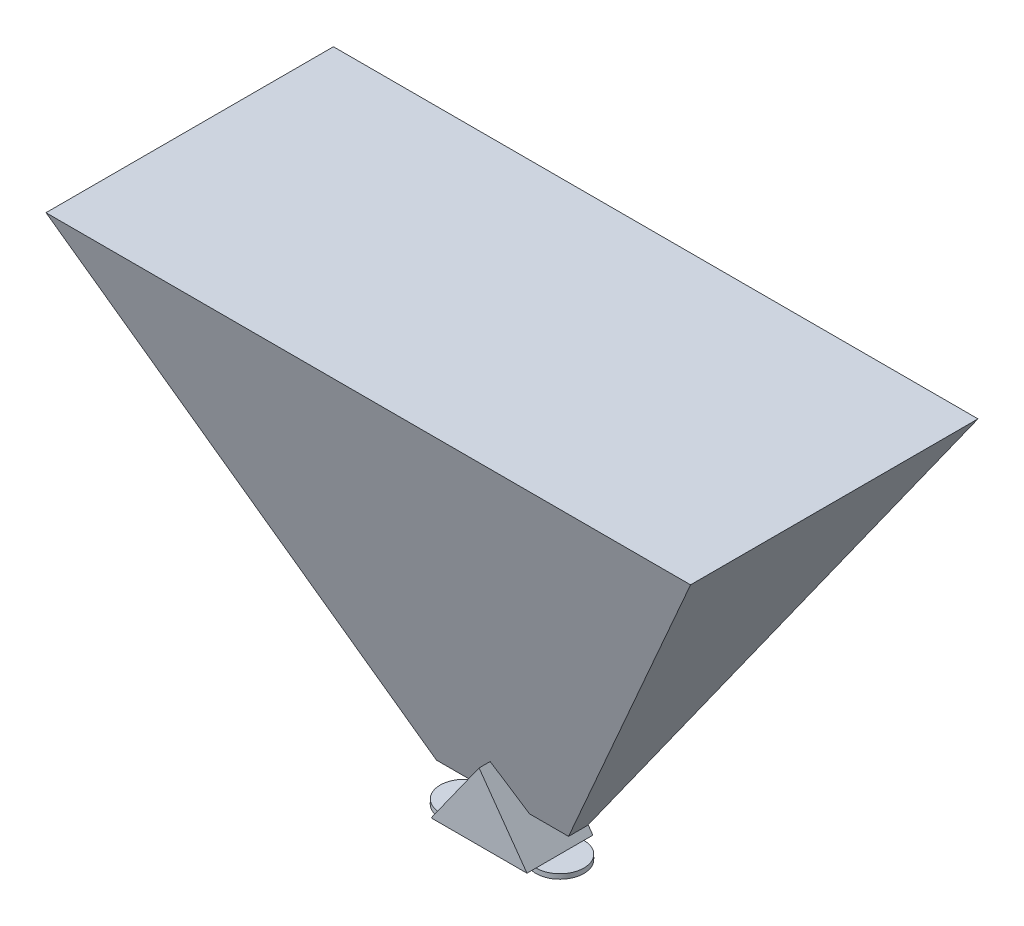
ISO-10303-21;
HEADER;
FILE_DESCRIPTION(('STEP AP214'),'2;1');
FILE_NAME('part.step','',(''),(''),'','','');
FILE_SCHEMA(('AUTOMOTIVE_DESIGN { 1 0 10303 214 1 1 1 1 }'));
ENDSEC;
DATA;
#1=APPLICATION_CONTEXT('core data for automotive mechanical design processes');
#2=APPLICATION_PROTOCOL_DEFINITION('international standard','automotive_design',2000,#1);
#3=PRODUCT_CONTEXT('',#1,'mechanical');
#4=PRODUCT('Part','Part','',(#3));
#5=PRODUCT_RELATED_PRODUCT_CATEGORY('part','',(#4));
#6=PRODUCT_DEFINITION_FORMATION('','',#4);
#7=PRODUCT_DEFINITION_CONTEXT('part definition',#1,'design');
#8=PRODUCT_DEFINITION('design','',#6,#7);
#9=PRODUCT_DEFINITION_SHAPE('','',#8);
#10=(LENGTH_UNIT() NAMED_UNIT(*) SI_UNIT(.MILLI.,.METRE.));
#11=(NAMED_UNIT(*) PLANE_ANGLE_UNIT() SI_UNIT($,.RADIAN.));
#12=(NAMED_UNIT(*) SI_UNIT($,.STERADIAN.) SOLID_ANGLE_UNIT());
#13=UNCERTAINTY_MEASURE_WITH_UNIT(LENGTH_MEASURE(1.E-05),#10,'distance_accuracy_value','');
#14=(GEOMETRIC_REPRESENTATION_CONTEXT(3) GLOBAL_UNCERTAINTY_ASSIGNED_CONTEXT((#13)) GLOBAL_UNIT_ASSIGNED_CONTEXT((#10,
#11,#12)) REPRESENTATION_CONTEXT('',''));
#15=CARTESIAN_POINT('',(0.,0.,0.));
#16=DIRECTION('',(0.,0.,1.));
#17=DIRECTION('',(1.,0.,0.));
#18=AXIS2_PLACEMENT_3D('',#15,#16,#17);
#19=CARTESIAN_POINT('',(0.,0.,-76.2));
#20=DIRECTION('',(0.,-1.,0.));
#21=DIRECTION('',(0.,0.,-1.));
#22=AXIS2_PLACEMENT_3D('',#19,#20,#21);
#23=PLANE('',#22);
#24=DIRECTION('',(1.,0.,0.));
#25=VECTOR('',#24,1.);
#26=CARTESIAN_POINT('',(-145.479084615994,0.,-17.4677334207872));
#27=LINE('',#26,#25);
#28=CARTESIAN_POINT('',(0.,0.,-17.4677334207872));
#29=VERTEX_POINT('',#28);
#30=CARTESIAN_POINT('',(50.8,0.,-17.4677334207872));
#31=VERTEX_POINT('',#30);
#32=EDGE_CURVE('E126',#29,#31,#27,.T.);
#33=ORIENTED_EDGE('',*,*,#32,.T.);
#34=DIRECTION('',(0.,0.,1.));
#35=VECTOR('',#34,1.);
#36=CARTESIAN_POINT('',(50.8,0.,-76.2));
#37=LINE('',#36,#35);
#38=CARTESIAN_POINT('',(50.8,0.,-12.7));
#39=VERTEX_POINT('',#38);
#40=EDGE_CURVE('E133',#31,#39,#37,.T.);
#41=ORIENTED_EDGE('',*,*,#40,.T.);
#42=CARTESIAN_POINT('',(50.8,0.,0.));
#43=DIRECTION('',(0.,-1.,0.));
#44=DIRECTION('',(0.,0.,-1.));
#45=AXIS2_PLACEMENT_3D('',#42,#43,#44);
#46=CIRCLE('',#45,12.7);
#47=CARTESIAN_POINT('',(50.8,0.,12.7));
#48=VERTEX_POINT('',#47);
#49=EDGE_CURVE('E184',#39,#48,#46,.F.);
#50=ORIENTED_EDGE('',*,*,#49,.T.);
#51=CARTESIAN_POINT('',(50.8,0.,17.4677334207872));
#52=VERTEX_POINT('',#51);
#53=EDGE_CURVE('E145',#48,#52,#37,.T.);
#54=ORIENTED_EDGE('',*,*,#53,.T.);
#55=DIRECTION('',(1.,0.,0.));
#56=VECTOR('',#55,1.);
#57=CARTESIAN_POINT('',(-145.479084615994,0.,17.4677334207872));
#58=LINE('',#57,#56);
#59=CARTESIAN_POINT('',(0.,0.,17.4677334207872));
#60=VERTEX_POINT('',#59);
#61=EDGE_CURVE('E61',#60,#52,#58,.T.);
#62=ORIENTED_EDGE('',*,*,#61,.F.);
#63=DIRECTION('',(0.,0.,1.));
#64=VECTOR('',#63,1.);
#65=CARTESIAN_POINT('',(0.,0.,-76.2));
#66=LINE('',#65,#64);
#67=CARTESIAN_POINT('',(0.,0.,12.7));
#68=VERTEX_POINT('',#67);
#69=EDGE_CURVE('E152',#68,#60,#66,.T.);
#70=ORIENTED_EDGE('',*,*,#69,.F.);
#71=CARTESIAN_POINT('',(0.,0.,0.));
#72=DIRECTION('',(0.,-1.,0.));
#73=DIRECTION('',(0.,0.,-1.));
#74=AXIS2_PLACEMENT_3D('',#71,#72,#73);
#75=CIRCLE('',#74,12.7);
#76=CARTESIAN_POINT('',(0.,0.,-12.7));
#77=VERTEX_POINT('',#76);
#78=EDGE_CURVE('E237',#77,#68,#75,.T.);
#79=ORIENTED_EDGE('',*,*,#78,.F.);
#80=EDGE_CURVE('E136',#29,#77,#66,.T.);
#81=ORIENTED_EDGE('',*,*,#80,.F.);
#82=EDGE_LOOP('',(#33,#41,#50,#54,#62,#70,#79,#81));
#83=FACE_BOUND('',#82,.T.);
#84=ADVANCED_FACE('F39',(#83),#23,.T.);
#85=CARTESIAN_POINT('',(-152.4,15.4986607616986,0.));
#86=DIRECTION('',(0.,1.,0.));
#87=DIRECTION('',(0.,0.,1.));
#88=AXIS2_PLACEMENT_3D('',#85,#86,#87);
#89=PLANE('',#88);
#90=DIRECTION('',(0.,0.,1.));
#91=VECTOR('',#90,1.);
#92=CARTESIAN_POINT('',(60.4133221390996,15.4986607616985,-76.2));
#93=LINE('',#92,#91);
#94=CARTESIAN_POINT('',(60.4133221390996,15.4986607616985,-5.03582014670799));
#95=VERTEX_POINT('',#94);
#96=CARTESIAN_POINT('',(60.4133221390996,15.4986607616985,5.03582014670785));
#97=VERTEX_POINT('',#96);
#98=EDGE_CURVE('E201',#95,#97,#93,.T.);
#99=ORIENTED_EDGE('',*,*,#98,.T.);
#100=DIRECTION('',(1.,0.,0.));
#101=VECTOR('',#100,1.);
#102=CARTESIAN_POINT('',(-152.4,15.4986607616986,5.03582014670786));
#103=LINE('',#102,#101);
#104=CARTESIAN_POINT('',(39.7540143591478,15.4986607616985,5.03582014670786));
#105=VERTEX_POINT('',#104);
#106=EDGE_CURVE('E196',#105,#97,#103,.T.);
#107=ORIENTED_EDGE('',*,*,#106,.F.);
#108=DIRECTION('',(0.,0.,1.));
#109=VECTOR('',#108,1.);
#110=CARTESIAN_POINT('',(39.7540143591478,15.4986607616986,-76.2));
#111=LINE('',#110,#109);
#112=CARTESIAN_POINT('',(39.7540143591478,15.4986607616986,-5.03582014670799));
#113=VERTEX_POINT('',#112);
#114=EDGE_CURVE('E171',#113,#105,#111,.T.);
#115=ORIENTED_EDGE('',*,*,#114,.F.);
#116=DIRECTION('',(1.,0.,0.));
#117=VECTOR('',#116,1.);
#118=CARTESIAN_POINT('',(-152.4,15.4986607616986,-5.03582014670799));
#119=LINE('',#118,#117);
#120=EDGE_CURVE('E214',#113,#95,#119,.T.);
#121=ORIENTED_EDGE('',*,*,#120,.T.);
#122=EDGE_LOOP('',(#99,#107,#115,#121));
#123=FACE_BOUND('',#122,.T.);
#124=ADVANCED_FACE('F199',(#123),#89,.F.);
#125=CARTESIAN_POINT('',(-152.4,0.,0.));
#126=DIRECTION('',(0.,0.309016994374942,-0.951056516295155));
#127=DIRECTION('',(0.,0.951056516295155,0.309016994374942));
#128=AXIS2_PLACEMENT_3D('',#125,#126,#127);
#129=PLANE('',#128);
#130=DIRECTION('',(-0.508091264626095,-0.819148056465713,-0.26615733767661));
#131=VECTOR('',#130,1.);
#132=CARTESIAN_POINT('',(-1.65744818407482,-84.5722406952965,-27.4791867564514));
#133=LINE('',#132,#131);
#134=CARTESIAN_POINT('',(196.264914484343,234.519485532759,76.2));
#135=VERTEX_POINT('',#134);
#136=EDGE_CURVE('E229',#135,#97,#133,.T.);
#137=ORIENTED_EDGE('',*,*,#136,.F.);
#138=DIRECTION('',(1.,0.,0.));
#139=VECTOR('',#138,1.);
#140=CARTESIAN_POINT('',(-152.4,234.519485532759,76.2));
#141=LINE('',#140,#139);
#142=CARTESIAN_POINT('',(-145.479084615994,234.519485532759,76.2));
#143=VERTEX_POINT('',#142);
#144=EDGE_CURVE('E203',#143,#135,#141,.T.);
#145=ORIENTED_EDGE('',*,*,#144,.F.);
#146=DIRECTION('',(0.508127980437823,-0.819127456511238,-0.266150644345659));
#147=VECTOR('',#146,1.);
#148=CARTESIAN_POINT('',(-39.3487723823864,63.4321688222073,20.6103610251056));
#149=LINE('',#148,#147);
#150=CARTESIAN_POINT('',(-9.61425859887299,15.498660761696,5.03582014670743));
#151=VERTEX_POINT('',#150);
#152=EDGE_CURVE('E208',#143,#151,#149,.T.);
#153=ORIENTED_EDGE('',*,*,#152,.T.);
#154=CARTESIAN_POINT('',(11.0459856408521,15.4986607616986,5.03582014670787));
#155=VERTEX_POINT('',#154);
#156=EDGE_CURVE('E202',#151,#155,#103,.T.);
#157=ORIENTED_EDGE('',*,*,#156,.T.);
#158=DIRECTION('',(-0.56107743663193,-0.787249697233074,-0.255792932484413));
#159=VECTOR('',#158,1.);
#160=CARTESIAN_POINT('',(12.8018805960927,17.9623630630852,5.83632555008273));
#161=LINE('',#160,#159);
#162=CARTESIAN_POINT('',(25.3999999999999,35.6388280907428,11.5797571973407));
#163=VERTEX_POINT('',#162);
#164=EDGE_CURVE('E160',#163,#155,#161,.T.);
#165=ORIENTED_EDGE('',*,*,#164,.F.);
#166=DIRECTION('',(-0.561077436631934,0.787249697233071,0.255792932484412));
#167=VECTOR('',#166,1.);
#168=CARTESIAN_POINT('',(37.9981194039071,17.9623630630854,5.83632555008276));
#169=LINE('',#168,#167);
#170=EDGE_CURVE('E173',#105,#163,#169,.T.);
#171=ORIENTED_EDGE('',*,*,#170,.F.);
#172=ORIENTED_EDGE('',*,*,#106,.T.);
#173=EDGE_LOOP('',(#137,#145,#153,#157,#165,#171,#172));
#174=FACE_BOUND('',#173,.T.);
#175=ADVANCED_FACE('F195',(#174),#129,.F.);
#176=CARTESIAN_POINT('',(-152.4,0.,0.));
#177=DIRECTION('',(0.,0.309016994374948,0.951056516295153));
#178=DIRECTION('',(0.,-0.951056516295154,0.309016994374948));
#179=AXIS2_PLACEMENT_3D('',#176,#177,#178);
#180=PLANE('',#179);
#181=DIRECTION('',(0.508091264626094,0.819148056465712,-0.266157337676615));
#182=VECTOR('',#181,1.);
#183=CARTESIAN_POINT('',(-1.65744818407465,-84.5722406952963,27.4791867564519));
#184=LINE('',#183,#182);
#185=CARTESIAN_POINT('',(196.264914484343,234.519485532759,-76.2));
#186=VERTEX_POINT('',#185);
#187=EDGE_CURVE('E181',#95,#186,#184,.T.);
#188=ORIENTED_EDGE('',*,*,#187,.F.);
#189=ORIENTED_EDGE('',*,*,#120,.F.);
#190=DIRECTION('',(0.561077436631934,-0.78724969723307,0.255792932484417));
#191=VECTOR('',#190,1.);
#192=CARTESIAN_POINT('',(16.1257258309884,48.651594341759,-15.807861254771));
#193=LINE('',#192,#191);
#194=CARTESIAN_POINT('',(25.3999999999999,35.6388280907428,-11.579757197341));
#195=VERTEX_POINT('',#194);
#196=EDGE_CURVE('E168',#195,#113,#193,.T.);
#197=ORIENTED_EDGE('',*,*,#196,.F.);
#198=DIRECTION('',(0.561077436631929,0.787249697233073,-0.255792932484418));
#199=VECTOR('',#198,1.);
#200=CARTESIAN_POINT('',(34.6742741690113,48.6515943417591,-15.807861254771));
#201=LINE('',#200,#199);
#202=CARTESIAN_POINT('',(11.0459856408521,15.4986607616986,-5.03582014670799));
#203=VERTEX_POINT('',#202);
#204=EDGE_CURVE('E165',#203,#195,#201,.T.);
#205=ORIENTED_EDGE('',*,*,#204,.F.);
#206=CARTESIAN_POINT('',(-9.61425859887299,15.498660761696,-5.03582014670756));
#207=VERTEX_POINT('',#206);
#208=EDGE_CURVE('E213',#207,#203,#119,.T.);
#209=ORIENTED_EDGE('',*,*,#208,.F.);
#210=DIRECTION('',(-0.508127980437822,0.819127456511237,-0.266150644345665));
#211=VECTOR('',#210,1.);
#212=CARTESIAN_POINT('',(-39.3487723823863,63.4321688222071,-20.610361025106));
#213=LINE('',#212,#211);
#214=CARTESIAN_POINT('',(-145.479084615994,234.519485532759,-76.2));
#215=VERTEX_POINT('',#214);
#216=EDGE_CURVE('E178',#207,#215,#213,.T.);
#217=ORIENTED_EDGE('',*,*,#216,.T.);
#218=DIRECTION('',(1.,0.,0.));
#219=VECTOR('',#218,1.);
#220=CARTESIAN_POINT('',(-152.4,234.519485532754,-76.2));
#221=LINE('',#220,#219);
#222=EDGE_CURVE('E205',#215,#186,#221,.T.);
#223=ORIENTED_EDGE('',*,*,#222,.T.);
#224=EDGE_LOOP('',(#188,#189,#197,#205,#209,#217,#223));
#225=FACE_BOUND('',#224,.T.);
#226=ADVANCED_FACE('F219',(#225),#180,.F.);
#227=CARTESIAN_POINT('',(25.3999999999999,35.6388280907428,-76.2));
#228=DIRECTION('',(-0.814341541912721,0.580385951858944,0.));
#229=DIRECTION('',(-0.580385951858944,-0.814341541912721,0.));
#230=AXIS2_PLACEMENT_3D('',#227,#228,#229);
#231=PLANE('',#230);
#232=DIRECTION('',(0.580385951858944,0.814341541912721,0.));
#233=VECTOR('',#232,1.);
#234=CARTESIAN_POINT('',(25.3999999999999,35.6388280907428,-17.4677334207873));
#235=LINE('',#234,#233);
#236=CARTESIAN_POINT('',(25.3999999999999,35.6388280907428,-17.4677334207873));
#237=VERTEX_POINT('',#236);
#238=EDGE_CURVE('E53',#29,#237,#235,.T.);
#239=ORIENTED_EDGE('',*,*,#238,.F.);
#240=ORIENTED_EDGE('',*,*,#80,.T.);
#241=EDGE_CURVE('E151',#77,#68,#66,.T.);
#242=ORIENTED_EDGE('',*,*,#241,.T.);
#243=ORIENTED_EDGE('',*,*,#69,.T.);
#244=DIRECTION('',(-0.580385951858944,-0.814341541912721,0.));
#245=VECTOR('',#244,1.);
#246=CARTESIAN_POINT('',(25.3999999999999,35.6388280907428,17.4677334207872));
#247=LINE('',#246,#245);
#248=CARTESIAN_POINT('',(25.3999999999999,35.6388280907427,17.4677334207872));
#249=VERTEX_POINT('',#248);
#250=EDGE_CURVE('E186',#249,#60,#247,.T.);
#251=ORIENTED_EDGE('',*,*,#250,.F.);
#252=DIRECTION('',(0.,0.,1.));
#253=VECTOR('',#252,1.);
#254=CARTESIAN_POINT('',(25.3999999999999,35.6388280907428,-76.2));
#255=LINE('',#254,#253);
#256=EDGE_CURVE('E143',#163,#249,#255,.T.);
#257=ORIENTED_EDGE('',*,*,#256,.F.);
#258=ORIENTED_EDGE('',*,*,#164,.T.);
#259=DIRECTION('',(0.,0.,-1.));
#260=VECTOR('',#259,1.);
#261=CARTESIAN_POINT('',(11.0459856408521,15.4986607616986,-76.2));
#262=LINE('',#261,#260);
#263=EDGE_CURVE('E156',#155,#203,#262,.T.);
#264=ORIENTED_EDGE('',*,*,#263,.T.);
#265=ORIENTED_EDGE('',*,*,#204,.T.);
#266=EDGE_CURVE('E147',#237,#195,#255,.T.);
#267=ORIENTED_EDGE('',*,*,#266,.F.);
#268=EDGE_LOOP('',(#239,#240,#242,#243,#251,#257,#258,#264,#265,#267));
#269=FACE_BOUND('',#268,.T.);
#270=ADVANCED_FACE('F41',(#269),#231,.T.);
#271=CARTESIAN_POINT('',(25.3999999999999,35.6388280907428,-76.2));
#272=DIRECTION('',(0.814341541912718,0.580385951858948,0.));
#273=DIRECTION('',(-0.580385951858948,0.814341541912718,0.));
#274=AXIS2_PLACEMENT_3D('',#271,#272,#273);
#275=PLANE('',#274);
#276=DIRECTION('',(0.580385951858948,-0.814341541912718,0.));
#277=VECTOR('',#276,1.);
#278=CARTESIAN_POINT('',(25.3999999999998,35.6388280907428,-17.4677334207873));
#279=LINE('',#278,#277);
#280=EDGE_CURVE('E11',#237,#31,#279,.T.);
#281=ORIENTED_EDGE('',*,*,#280,.F.);
#282=ORIENTED_EDGE('',*,*,#266,.T.);
#283=ORIENTED_EDGE('',*,*,#196,.T.);
#284=ORIENTED_EDGE('',*,*,#114,.T.);
#285=ORIENTED_EDGE('',*,*,#170,.T.);
#286=ORIENTED_EDGE('',*,*,#256,.T.);
#287=DIRECTION('',(-0.580385951858948,0.814341541912718,0.));
#288=VECTOR('',#287,1.);
#289=CARTESIAN_POINT('',(25.3999999999999,35.6388280907428,17.4677334207872));
#290=LINE('',#289,#288);
#291=EDGE_CURVE('E47',#52,#249,#290,.T.);
#292=ORIENTED_EDGE('',*,*,#291,.F.);
#293=ORIENTED_EDGE('',*,*,#53,.F.);
#294=EDGE_CURVE('E142',#39,#48,#37,.T.);
#295=ORIENTED_EDGE('',*,*,#294,.F.);
#296=ORIENTED_EDGE('',*,*,#40,.F.);
#297=EDGE_LOOP('',(#281,#282,#283,#284,#285,#286,#292,#293,#295,#296));
#298=FACE_BOUND('',#297,.T.);
#299=ADVANCED_FACE('F139',(#298),#275,.T.);
#300=ORIENTED_EDGE('',*,*,#156,.F.);
#301=DIRECTION('',(0.,0.,1.));
#302=VECTOR('',#301,1.);
#303=CARTESIAN_POINT('',(-9.61425859887299,15.498660761696,-76.2));
#304=LINE('',#303,#302);
#305=EDGE_CURVE('E221',#207,#151,#304,.T.);
#306=ORIENTED_EDGE('',*,*,#305,.F.);
#307=ORIENTED_EDGE('',*,*,#208,.T.);
#308=ORIENTED_EDGE('',*,*,#263,.F.);
#309=EDGE_LOOP('',(#300,#306,#307,#308));
#310=FACE_BOUND('',#309,.T.);
#311=ADVANCED_FACE('F276',(#310),#89,.F.);
#312=CARTESIAN_POINT('',(-4.08186414492102E-12,-2.53209603449768E-12,-76.2));
#313=DIRECTION('',(0.849777708841294,0.527141200776833,0.));
#314=DIRECTION('',(-0.527141200776833,0.849777708841294,0.));
#315=AXIS2_PLACEMENT_3D('',#312,#313,#314);
#316=PLANE('',#315);
#317=DIRECTION('',(0.,0.,1.));
#318=VECTOR('',#317,1.);
#319=CARTESIAN_POINT('',(-145.479084615994,234.519485532759,-76.2));
#320=LINE('',#319,#318);
#321=EDGE_CURVE('E225',#215,#143,#320,.T.);
#322=ORIENTED_EDGE('',*,*,#321,.F.);
#323=ORIENTED_EDGE('',*,*,#216,.F.);
#324=ORIENTED_EDGE('',*,*,#305,.T.);
#325=ORIENTED_EDGE('',*,*,#152,.F.);
#326=EDGE_LOOP('',(#322,#323,#324,#325));
#327=FACE_BOUND('',#326,.T.);
#328=ADVANCED_FACE('F284',(#327),#316,.F.);
#329=CARTESIAN_POINT('',(36.6857912387674,-22.7550195806324,-76.2));
#330=DIRECTION('',(0.849800708906285,-0.527104121727742,0.));
#331=DIRECTION('',(0.527104121727742,0.849800708906285,0.));
#332=AXIS2_PLACEMENT_3D('',#329,#330,#331);
#333=PLANE('',#332);
#334=ORIENTED_EDGE('',*,*,#136,.T.);
#335=ORIENTED_EDGE('',*,*,#98,.F.);
#336=ORIENTED_EDGE('',*,*,#187,.T.);
#337=DIRECTION('',(0.,0.,1.));
#338=VECTOR('',#337,1.);
#339=CARTESIAN_POINT('',(196.264914484343,234.519485532759,-76.2));
#340=LINE('',#339,#338);
#341=EDGE_CURVE('E232',#186,#135,#340,.T.);
#342=ORIENTED_EDGE('',*,*,#341,.T.);
#343=EDGE_LOOP('',(#334,#335,#336,#342));
#344=FACE_BOUND('',#343,.T.);
#345=ADVANCED_FACE('F287',(#344),#333,.T.);
#346=CARTESIAN_POINT('',(-152.400000000007,234.519485532759,76.2));
#347=DIRECTION('',(0.,-1.,0.));
#348=DIRECTION('',(0.,0.,-1.));
#349=AXIS2_PLACEMENT_3D('',#346,#347,#348);
#350=PLANE('',#349);
#351=ORIENTED_EDGE('',*,*,#144,.T.);
#352=ORIENTED_EDGE('',*,*,#341,.F.);
#353=ORIENTED_EDGE('',*,*,#222,.F.);
#354=ORIENTED_EDGE('',*,*,#321,.T.);
#355=EDGE_LOOP('',(#351,#352,#353,#354));
#356=FACE_BOUND('',#355,.T.);
#357=ADVANCED_FACE('F290',(#356),#350,.F.);
#358=CARTESIAN_POINT('',(0.,-2.54,0.));
#359=DIRECTION('',(0.,1.,0.));
#360=DIRECTION('',(0.,0.,1.));
#361=AXIS2_PLACEMENT_3D('',#358,#359,#360);
#362=CYLINDRICAL_SURFACE('',#361,12.7);
#363=CARTESIAN_POINT('',(0.,-2.54,0.));
#364=DIRECTION('',(0.,-1.,0.));
#365=DIRECTION('',(0.,0.,-1.));
#366=AXIS2_PLACEMENT_3D('',#363,#364,#365);
#367=CIRCLE('',#366,12.7);
#368=CARTESIAN_POINT('',(0.,-2.54,-12.7));
#369=VERTEX_POINT('',#368);
#370=EDGE_CURVE('E234',#369,#369,#367,.T.);
#371=ORIENTED_EDGE('',*,*,#370,.F.);
#372=EDGE_LOOP('',(#371));
#373=FACE_BOUND('',#372,.T.);
#374=ORIENTED_EDGE('',*,*,#78,.T.);
#375=EDGE_CURVE('E240',#68,#77,#75,.T.);
#376=ORIENTED_EDGE('',*,*,#375,.T.);
#377=EDGE_LOOP('',(#374,#376));
#378=FACE_BOUND('',#377,.T.);
#379=ADVANCED_FACE('F253',(#373,#378),#362,.T.);
#380=CARTESIAN_POINT('',(0.,-2.54,0.));
#381=DIRECTION('',(0.,-1.,0.));
#382=DIRECTION('',(0.,0.,-1.));
#383=AXIS2_PLACEMENT_3D('',#380,#381,#382);
#384=PLANE('',#383);
#385=ORIENTED_EDGE('',*,*,#370,.T.);
#386=EDGE_LOOP('',(#385));
#387=FACE_BOUND('',#386,.T.);
#388=ADVANCED_FACE('F259',(#387),#384,.T.);
#389=CARTESIAN_POINT('',(0.,0.,0.));
#390=DIRECTION('',(0.,-1.,0.));
#391=DIRECTION('',(0.,0.,-1.));
#392=AXIS2_PLACEMENT_3D('',#389,#390,#391);
#393=PLANE('',#392);
#394=ORIENTED_EDGE('',*,*,#241,.F.);
#395=ORIENTED_EDGE('',*,*,#375,.F.);
#396=EDGE_LOOP('',(#394,#395));
#397=FACE_BOUND('',#396,.T.);
#398=ADVANCED_FACE('F256',(#397),#393,.F.);
#399=CARTESIAN_POINT('',(50.8,-2.54,0.));
#400=DIRECTION('',(0.,1.,0.));
#401=DIRECTION('',(0.,0.,1.));
#402=AXIS2_PLACEMENT_3D('',#399,#400,#401);
#403=CYLINDRICAL_SURFACE('',#402,12.7);
#404=CARTESIAN_POINT('',(50.8,-2.54,0.));
#405=DIRECTION('',(0.,-1.,0.));
#406=DIRECTION('',(0.,0.,-1.));
#407=AXIS2_PLACEMENT_3D('',#404,#405,#406);
#408=CIRCLE('',#407,12.7);
#409=CARTESIAN_POINT('',(50.8,-2.54,-12.7));
#410=VERTEX_POINT('',#409);
#411=EDGE_CURVE('E244',#410,#410,#408,.T.);
#412=ORIENTED_EDGE('',*,*,#411,.F.);
#413=EDGE_LOOP('',(#412));
#414=FACE_BOUND('',#413,.T.);
#415=CARTESIAN_POINT('',(50.8,0.,0.));
#416=DIRECTION('',(0.,-1.,0.));
#417=DIRECTION('',(0.,0.,-1.));
#418=AXIS2_PLACEMENT_3D('',#415,#416,#417);
#419=CIRCLE('',#418,12.7);
#420=EDGE_CURVE('E188',#39,#48,#419,.T.);
#421=ORIENTED_EDGE('',*,*,#420,.T.);
#422=ORIENTED_EDGE('',*,*,#49,.F.);
#423=EDGE_LOOP('',(#421,#422));
#424=FACE_BOUND('',#423,.T.);
#425=ADVANCED_FACE('F258',(#414,#424),#403,.T.);
#426=CARTESIAN_POINT('',(50.8,-2.54,0.));
#427=DIRECTION('',(0.,-1.,0.));
#428=DIRECTION('',(0.,0.,-1.));
#429=AXIS2_PLACEMENT_3D('',#426,#427,#428);
#430=PLANE('',#429);
#431=ORIENTED_EDGE('',*,*,#411,.T.);
#432=EDGE_LOOP('',(#431));
#433=FACE_BOUND('',#432,.T.);
#434=ADVANCED_FACE('F265',(#433),#430,.T.);
#435=CARTESIAN_POINT('',(50.8,0.,0.));
#436=DIRECTION('',(0.,-1.,0.));
#437=DIRECTION('',(0.,0.,-1.));
#438=AXIS2_PLACEMENT_3D('',#435,#436,#437);
#439=PLANE('',#438);
#440=ORIENTED_EDGE('',*,*,#294,.T.);
#441=ORIENTED_EDGE('',*,*,#420,.F.);
#442=EDGE_LOOP('',(#440,#441));
#443=FACE_BOUND('',#442,.T.);
#444=ADVANCED_FACE('F324',(#443),#439,.F.);
#445=CARTESIAN_POINT('',(-145.479084615994,35.6388280907428,17.4677334207872));
#446=DIRECTION('',(0.,0.,-1.));
#447=DIRECTION('',(-1.,0.,0.));
#448=AXIS2_PLACEMENT_3D('',#445,#446,#447);
#449=PLANE('',#448);
#450=ORIENTED_EDGE('',*,*,#250,.T.);
#451=ORIENTED_EDGE('',*,*,#61,.T.);
#452=ORIENTED_EDGE('',*,*,#291,.T.);
#453=EDGE_LOOP('',(#450,#451,#452));
#454=FACE_BOUND('',#453,.T.);
#455=ADVANCED_FACE('F185',(#454),#449,.F.);
#456=CARTESIAN_POINT('',(-145.479084615994,35.6388280907427,-17.4677334207873));
#457=DIRECTION('',(0.,0.,1.));
#458=DIRECTION('',(0.,-1.,0.));
#459=AXIS2_PLACEMENT_3D('',#456,#457,#458);
#460=PLANE('',#459);
#461=ORIENTED_EDGE('',*,*,#238,.T.);
#462=ORIENTED_EDGE('',*,*,#280,.T.);
#463=ORIENTED_EDGE('',*,*,#32,.F.);
#464=EDGE_LOOP('',(#461,#462,#463));
#465=FACE_BOUND('',#464,.T.);
#466=ADVANCED_FACE('F125',(#465),#460,.F.);
#467=CLOSED_SHELL('',(#84,#124,#175,#226,#270,#299,#311,#328,#345,#357,#379,#388,#398,#425,#434,
#444,#455,#466));
#468=MANIFOLD_SOLID_BREP('B2',#467);
#469=ADVANCED_BREP_SHAPE_REPRESENTATION('',(#18,#468),#14);
#470=SHAPE_DEFINITION_REPRESENTATION(#9,#469);
ENDSEC;
END-ISO-10303-21;
